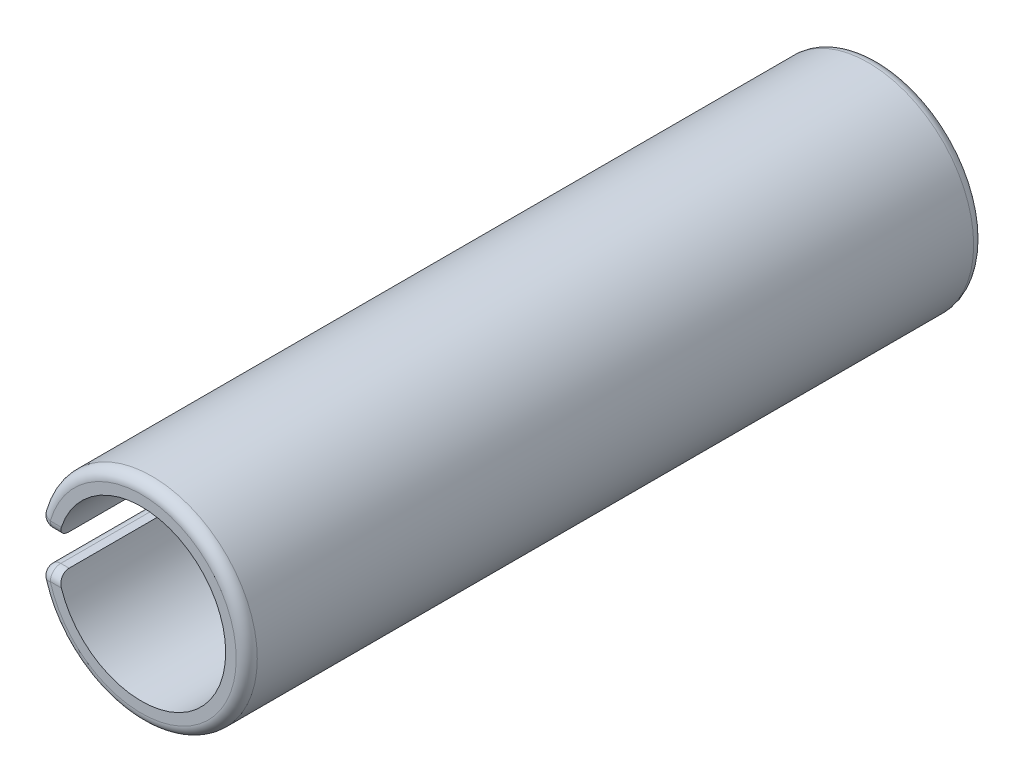
ISO-10303-21;
HEADER;
FILE_DESCRIPTION(('STEP AP214'),'2;1');
FILE_NAME('part.step','',(''),(''),'','','');
FILE_SCHEMA(('AUTOMOTIVE_DESIGN { 1 0 10303 214 1 1 1 1 }'));
ENDSEC;
DATA;
#1=APPLICATION_CONTEXT('core data for automotive mechanical design processes');
#2=APPLICATION_PROTOCOL_DEFINITION('international standard','automotive_design',2000,#1);
#3=PRODUCT_CONTEXT('',#1,'mechanical');
#4=PRODUCT('Part','Part','',(#3));
#5=PRODUCT_RELATED_PRODUCT_CATEGORY('part','',(#4));
#6=PRODUCT_DEFINITION_FORMATION('','',#4);
#7=PRODUCT_DEFINITION_CONTEXT('part definition',#1,'design');
#8=PRODUCT_DEFINITION('design','',#6,#7);
#9=PRODUCT_DEFINITION_SHAPE('','',#8);
#10=(LENGTH_UNIT() NAMED_UNIT(*) SI_UNIT(.MILLI.,.METRE.));
#11=(NAMED_UNIT(*) PLANE_ANGLE_UNIT() SI_UNIT($,.RADIAN.));
#12=(NAMED_UNIT(*) SI_UNIT($,.STERADIAN.) SOLID_ANGLE_UNIT());
#13=UNCERTAINTY_MEASURE_WITH_UNIT(LENGTH_MEASURE(1.E-05),#10,'distance_accuracy_value','');
#14=(GEOMETRIC_REPRESENTATION_CONTEXT(3) GLOBAL_UNCERTAINTY_ASSIGNED_CONTEXT((#13)) GLOBAL_UNIT_ASSIGNED_CONTEXT((#10,
#11,#12)) REPRESENTATION_CONTEXT('',''));
#15=CARTESIAN_POINT('',(0.,0.,0.));
#16=DIRECTION('',(0.,0.,1.));
#17=DIRECTION('',(1.,0.,0.));
#18=AXIS2_PLACEMENT_3D('',#15,#16,#17);
#19=CARTESIAN_POINT('',(0.,0.,7.));
#20=DIRECTION('',(0.,0.,-1.));
#21=DIRECTION('',(-1.,0.,0.));
#22=AXIS2_PLACEMENT_3D('',#19,#20,#21);
#23=CYLINDRICAL_SURFACE('',#22,0.8);
#24=CARTESIAN_POINT('',(0.,0.,0.));
#25=DIRECTION('',(0.,0.,-1.));
#26=DIRECTION('',(1.,0.,0.));
#27=AXIS2_PLACEMENT_3D('',#24,#25,#26);
#28=CIRCLE('',#27,0.8);
#29=CARTESIAN_POINT('',(-0.760178574143633,0.249255963645713,0.));
#30=VERTEX_POINT('',#29);
#31=CARTESIAN_POINT('',(-0.760178574143633,-0.249255963645713,0.));
#32=VERTEX_POINT('',#31);
#33=EDGE_CURVE('E174',#30,#32,#28,.T.);
#34=ORIENTED_EDGE('',*,*,#33,.T.);
#35=CARTESIAN_POINT('',(-0.760178574143633,-0.249255963645713,0.));
#36=CARTESIAN_POINT('',(-0.762034373791151,-0.243604474789476,-4.7820848283987E-06));
#37=CARTESIAN_POINT('',(-0.763823178565598,-0.237927979630275,0.000480037589871912));
#38=CARTESIAN_POINT('',(-0.767233274198211,-0.226685985508127,0.00241954308053262));
#39=CARTESIAN_POINT('',(-0.768854405144669,-0.221120596515532,0.00387514506420562));
#40=CARTESIAN_POINT('',(-0.771894485921598,-0.210264215201868,0.0077500325985201));
#41=CARTESIAN_POINT('',(-0.773313098861837,-0.204973689204183,0.0101708990791594));
#42=CARTESIAN_POINT('',(-0.775924117107872,-0.194856335965049,0.0159227912264894));
#43=CARTESIAN_POINT('',(-0.777116713803933,-0.190029118120206,0.0192530409420635));
#44=CARTESIAN_POINT('',(-0.779233676422341,-0.181149384419126,0.0266154372358896));
#45=CARTESIAN_POINT('',(-0.780165518525607,-0.177076745138274,0.0306211660890916));
#46=CARTESIAN_POINT('',(-0.781813172122858,-0.169654519644624,0.0392954440572709));
#47=CARTESIAN_POINT('',(-0.782528934773591,-0.16630509695854,0.0439641426817826));
#48=CARTESIAN_POINT('',(-0.783734761683959,-0.160525191894378,0.053691497308988));
#49=CARTESIAN_POINT('',(-0.784230415587064,-0.158072270501017,0.058736160579526));
#50=CARTESIAN_POINT('',(-0.785032130913807,-0.154041587974791,0.0691757131598106));
#51=CARTESIAN_POINT('',(-0.785338352374946,-0.152463088225739,0.0745703025734654));
#52=CARTESIAN_POINT('',(-0.785681991062046,-0.150679308070071,0.0833387267293841));
#53=CARTESIAN_POINT('',(-0.785777983935699,-0.150177071738878,0.0866528138086198));
#54=CARTESIAN_POINT('',(-0.785905612550893,-0.149507217659062,0.0933107620777523));
#55=CARTESIAN_POINT('',(-0.785937345921645,-0.149339092304195,0.0966545703366233));
#56=CARTESIAN_POINT('',(-0.785937500001154,-0.149339365519078,0.0999999999998808));
#57=B_SPLINE_CURVE_WITH_KNOTS('',3,(#35,#36,#37,#38,#39,#40,#41,#42,#43,#44,#45,#46,#47,#48,#49,
#50,#51,#52,#53,#54,#55,#56),.UNSPECIFIED.,.F.,.F.,(4,2,2,2,2,2,2,2,2,2,4),(0.,
0.0178294334925496,0.0356757172196497,0.0535513508143839,0.0714117790399948,0.0886900227768253,
0.105972169220704,0.122786073025214,0.139585752533472,0.149629758237893,0.159658492640139),.UNSPECIFIED.);
#58=CARTESIAN_POINT('',(-0.7859375,-0.149339365519444,0.1));
#59=VERTEX_POINT('',#58);
#60=EDGE_CURVE('E125',#32,#59,#57,.T.);
#61=ORIENTED_EDGE('',*,*,#60,.T.);
#62=DIRECTION('',(0.,0.,-1.));
#63=VECTOR('',#62,1.);
#64=CARTESIAN_POINT('',(-0.7859375,-0.149339365519444,7.));
#65=LINE('',#64,#63);
#66=CARTESIAN_POINT('',(-0.7859375,-0.149339365519444,6.9));
#67=VERTEX_POINT('',#66);
#68=EDGE_CURVE('E135',#67,#59,#65,.T.);
#69=ORIENTED_EDGE('',*,*,#68,.F.);
#70=CARTESIAN_POINT('',(-0.7859375,-0.149339365519444,6.9));
#71=CARTESIAN_POINT('',(-0.785936806785317,-0.149334224008504,6.905541611609));
#72=CARTESIAN_POINT('',(-0.785850059611193,-0.149799408980577,6.91108159940369));
#73=CARTESIAN_POINT('',(-0.785499326025954,-0.151632360406898,6.92199870590505));
#74=CARTESIAN_POINT('',(-0.785235525003097,-0.152999182755589,6.92737598882708));
#75=CARTESIAN_POINT('',(-0.784525422446089,-0.156598245657927,6.93782250829476));
#76=CARTESIAN_POINT('',(-0.784079043573676,-0.158830852929112,6.94289161325266));
#77=CARTESIAN_POINT('',(-0.78299556306561,-0.164088917115056,6.95257691781072));
#78=CARTESIAN_POINT('',(-0.782358483913237,-0.167114280559805,6.95719317071633));
#79=CARTESIAN_POINT('',(-0.780883702730964,-0.173875258386546,6.96586339672639));
#80=CARTESIAN_POINT('',(-0.780045272172356,-0.177613441532789,6.96991524158251));
#81=CARTESIAN_POINT('',(-0.77816568728146,-0.185675157011518,6.97733105900853));
#82=CARTESIAN_POINT('',(-0.777124514046398,-0.18999874391284,6.98069496737845));
#83=CARTESIAN_POINT('',(-0.774826156995347,-0.199165898078559,6.98669912228384));
#84=CARTESIAN_POINT('',(-0.773565986501359,-0.204016251629827,6.98932784268251));
#85=CARTESIAN_POINT('',(-0.770853271575422,-0.214037758467675,6.99374036827858));
#86=CARTESIAN_POINT('',(-0.7694007034289,-0.219208951258462,6.99552406919622));
#87=CARTESIAN_POINT('',(-0.766672943352768,-0.228540168507746,6.9979169800578));
#88=CARTESIAN_POINT('',(-0.76543114068079,-0.232666569686373,6.9986999645841));
#89=CARTESIAN_POINT('',(-0.762864086549483,-0.2409511004721,6.99974144747287));
#90=CARTESIAN_POINT('',(-0.761538993327098,-0.245109157468912,7.00000091112432));
#91=CARTESIAN_POINT('',(-0.760178574143787,-0.249255963645637,7.00000000000047));
#92=B_SPLINE_CURVE_WITH_KNOTS('',3,(#70,#71,#72,#73,#74,#75,#76,#77,#78,#79,#80,#81,#82,#83,#84,
#85,#86,#87,#88,#89,#90,#91),.UNSPECIFIED.,.F.,.F.,(4,2,2,2,2,2,2,2,2,2,4),(0.,
0.016602299121161,0.0331872414915355,0.0497792163752727,0.0663692358598374,0.0830202104396774,
0.0996727382221756,0.116573323063502,0.133475992981086,0.146583998529851,0.15966781283933),.UNSPECIFIED.);
#93=CARTESIAN_POINT('',(-0.760178574143633,-0.249255963645713,7.));
#94=VERTEX_POINT('',#93);
#95=EDGE_CURVE('E139',#67,#94,#92,.T.);
#96=ORIENTED_EDGE('',*,*,#95,.T.);
#97=CARTESIAN_POINT('',(0.,0.,7.));
#98=DIRECTION('',(0.,0.,-1.));
#99=DIRECTION('',(1.,0.,0.));
#100=AXIS2_PLACEMENT_3D('',#97,#98,#99);
#101=CIRCLE('',#100,0.8);
#102=CARTESIAN_POINT('',(-0.760178574143633,0.249255963645713,7.));
#103=VERTEX_POINT('',#102);
#104=EDGE_CURVE('E179',#103,#94,#101,.T.);
#105=ORIENTED_EDGE('',*,*,#104,.F.);
#106=CARTESIAN_POINT('',(-0.760178574143633,0.249255963645713,7.));
#107=CARTESIAN_POINT('',(-0.762034373791152,0.243604474789476,7.00000478208483));
#108=CARTESIAN_POINT('',(-0.763823178565598,0.237927979630276,6.99951996241013));
#109=CARTESIAN_POINT('',(-0.767233274198211,0.226685985508128,6.99758045691947));
#110=CARTESIAN_POINT('',(-0.768854405144669,0.221120596515532,6.99612485493579));
#111=CARTESIAN_POINT('',(-0.771894485921598,0.210264215201868,6.99224996740148));
#112=CARTESIAN_POINT('',(-0.773313098861837,0.204973689204183,6.98982910092084));
#113=CARTESIAN_POINT('',(-0.775924117107872,0.194856335965049,6.98407720877351));
#114=CARTESIAN_POINT('',(-0.777116713803933,0.190029118120207,6.98074695905794));
#115=CARTESIAN_POINT('',(-0.779233676422341,0.181149384419126,6.97338456276411));
#116=CARTESIAN_POINT('',(-0.780165518525607,0.177076745138275,6.96937883391091));
#117=CARTESIAN_POINT('',(-0.781813172122858,0.169654519644625,6.96070455594273));
#118=CARTESIAN_POINT('',(-0.782528934773591,0.16630509695854,6.95603585731822));
#119=CARTESIAN_POINT('',(-0.783734761683959,0.160525191894378,6.94630850269101));
#120=CARTESIAN_POINT('',(-0.784230415587063,0.158072270501017,6.94126383942047));
#121=CARTESIAN_POINT('',(-0.785032130913807,0.154041587974791,6.93082428684019));
#122=CARTESIAN_POINT('',(-0.785338352374946,0.152463088225739,6.92542969742654));
#123=CARTESIAN_POINT('',(-0.785681991062046,0.150679308070071,6.91666127327062));
#124=CARTESIAN_POINT('',(-0.785777983935699,0.150177071738878,6.91334718619138));
#125=CARTESIAN_POINT('',(-0.785905612550893,0.149507217659062,6.90668923792225));
#126=CARTESIAN_POINT('',(-0.785937345921645,0.149339092304195,6.90334542966338));
#127=CARTESIAN_POINT('',(-0.785937500001153,0.149339365519078,6.90000000000012));
#128=B_SPLINE_CURVE_WITH_KNOTS('',3,(#106,#107,#108,#109,#110,#111,#112,#113,#114,#115,#116,
#117,#118,#119,#120,#121,#122,#123,#124,#125,#126,#127),.UNSPECIFIED.,.F.,.F.,(4,2,2,2,2,2,2,2,
2,2,4),(0.,0.0178294334925495,0.0356757172196494,0.0535513508143829,0.0714117790399941,
0.0886900227768252,0.105972169220703,0.122786073025214,0.139585752533472,0.149629758237893,
0.159658492640139),.UNSPECIFIED.);
#129=CARTESIAN_POINT('',(-0.7859375,0.149339365519444,6.9));
#130=VERTEX_POINT('',#129);
#131=EDGE_CURVE('E205',#103,#130,#128,.T.);
#132=ORIENTED_EDGE('',*,*,#131,.T.);
#133=DIRECTION('',(0.,0.,-1.));
#134=VECTOR('',#133,1.);
#135=CARTESIAN_POINT('',(-0.7859375,0.149339365519444,7.));
#136=LINE('',#135,#134);
#137=CARTESIAN_POINT('',(-0.7859375,0.149339365519444,0.1));
#138=VERTEX_POINT('',#137);
#139=EDGE_CURVE('E185',#130,#138,#136,.T.);
#140=ORIENTED_EDGE('',*,*,#139,.T.);
#141=CARTESIAN_POINT('',(-0.7859375,0.149339365519444,0.1));
#142=CARTESIAN_POINT('',(-0.785936806785317,0.149334224008504,0.0944583883910013));
#143=CARTESIAN_POINT('',(-0.785850059611193,0.149799408980578,0.088918400596316));
#144=CARTESIAN_POINT('',(-0.785499326025954,0.151632360406898,0.0780012940949516));
#145=CARTESIAN_POINT('',(-0.785235525003097,0.152999182755589,0.0726240111729203));
#146=CARTESIAN_POINT('',(-0.784525422446089,0.156598245657927,0.0621774917052396));
#147=CARTESIAN_POINT('',(-0.784079043573676,0.158830852929112,0.057108386747343));
#148=CARTESIAN_POINT('',(-0.782995563065611,0.164088917115055,0.0474230821892813));
#149=CARTESIAN_POINT('',(-0.782358483913237,0.167114280559804,0.0428068292836715));
#150=CARTESIAN_POINT('',(-0.780883702730965,0.173875258386546,0.0341366032736137));
#151=CARTESIAN_POINT('',(-0.780045272172356,0.177613441532789,0.0300847584174928));
#152=CARTESIAN_POINT('',(-0.77816568728146,0.185675157011518,0.0226689409914739));
#153=CARTESIAN_POINT('',(-0.777124514046398,0.18999874391284,0.0193050326215479));
#154=CARTESIAN_POINT('',(-0.774826156995347,0.199165898078559,0.0133008777161637));
#155=CARTESIAN_POINT('',(-0.773565986501359,0.204016251629827,0.0106721573174859));
#156=CARTESIAN_POINT('',(-0.770853271575422,0.214037758467675,0.00625963172141697));
#157=CARTESIAN_POINT('',(-0.7694007034289,0.219208951258462,0.00447593080378067));
#158=CARTESIAN_POINT('',(-0.766672943352768,0.228540168507746,0.00208301994220113));
#159=CARTESIAN_POINT('',(-0.76543114068079,0.232666569686373,0.00130003541589759));
#160=CARTESIAN_POINT('',(-0.762864086549483,0.2409511004721,0.000258552527129145));
#161=CARTESIAN_POINT('',(-0.761538993327098,0.245109157468912,-9.11124322942692E-07));
#162=CARTESIAN_POINT('',(-0.760178574143787,0.249255963645637,-4.70918247226681E-13));
#163=B_SPLINE_CURVE_WITH_KNOTS('',3,(#141,#142,#143,#144,#145,#146,#147,#148,#149,#150,#151,
#152,#153,#154,#155,#156,#157,#158,#159,#160,#161,#162),.UNSPECIFIED.,.F.,.F.,(4,2,2,2,2,2,2,2,
2,2,4),(0.,0.0166022991211599,0.0331872414915352,0.0497792163752728,0.0663692358598367,
0.0830202104396773,0.0996727382221752,0.116573323063502,0.133475992981086,0.146583998529851,
0.15966781283933),.UNSPECIFIED.);
#164=EDGE_CURVE('E228',#138,#30,#163,.T.);
#165=ORIENTED_EDGE('',*,*,#164,.T.);
#166=EDGE_LOOP('',(#34,#61,#69,#96,#105,#132,#140,#165));
#167=FACE_BOUND('',#166,.T.);
#168=ADVANCED_FACE('F33',(#167),#23,.F.);
#169=CARTESIAN_POINT('',(-0.865023226150975,-0.149597057973271,7.));
#170=DIRECTION('',(0.00325837668062549,-0.999994691476613,0.));
#171=DIRECTION('',(0.999994691476613,0.00325837668062549,0.));
#172=AXIS2_PLACEMENT_3D('',#169,#170,#171);
#173=PLANE('',#172);
#174=ORIENTED_EDGE('',*,*,#68,.T.);
#175=DIRECTION('',(-0.999994691476613,-0.00325837668062549,0.));
#176=VECTOR('',#175,1.);
#177=CARTESIAN_POINT('',(-0.865023226150975,-0.149597057973271,0.1));
#178=LINE('',#177,#176);
#179=CARTESIAN_POINT('',(-0.865023226150975,-0.149597057973271,0.1));
#180=VERTEX_POINT('',#179);
#181=EDGE_CURVE('E134',#59,#180,#178,.T.);
#182=ORIENTED_EDGE('',*,*,#181,.T.);
#183=DIRECTION('',(0.,0.,-1.));
#184=VECTOR('',#183,1.);
#185=CARTESIAN_POINT('',(-0.865023226150975,-0.149597057973271,7.));
#186=LINE('',#185,#184);
#187=CARTESIAN_POINT('',(-0.865023226150975,-0.149597057973271,6.9));
#188=VERTEX_POINT('',#187);
#189=EDGE_CURVE('E119',#188,#180,#186,.T.);
#190=ORIENTED_EDGE('',*,*,#189,.F.);
#191=DIRECTION('',(-0.999994691476613,-0.00325837668062549,0.));
#192=VECTOR('',#191,1.);
#193=CARTESIAN_POINT('',(-0.7859375,-0.149339365519444,6.9));
#194=LINE('',#193,#192);
#195=EDGE_CURVE('E131',#188,#67,#194,.F.);
#196=ORIENTED_EDGE('',*,*,#195,.T.);
#197=EDGE_LOOP('',(#174,#182,#190,#196));
#198=FACE_BOUND('',#197,.T.);
#199=ADVANCED_FACE('F130',(#198),#173,.F.);
#200=CARTESIAN_POINT('',(-0.864697388482912,-0.249596527120932,7.));
#201=DIRECTION('',(0.,0.,-1.));
#202=DIRECTION('',(-1.,0.,0.));
#203=AXIS2_PLACEMENT_3D('',#200,#201,#202);
#204=CYLINDRICAL_SURFACE('',#203,0.1);
#205=ORIENTED_EDGE('',*,*,#189,.T.);
#206=CARTESIAN_POINT('',(-0.864697388482912,-0.249596527120932,0.1));
#207=DIRECTION('',(0.,0.,-1.));
#208=DIRECTION('',(-1.,0.,0.));
#209=AXIS2_PLACEMENT_3D('',#206,#207,#208);
#210=CIRCLE('',#209,0.1);
#211=CARTESIAN_POINT('',(-0.960774876092125,-0.277329474578814,0.1));
#212=VERTEX_POINT('',#211);
#213=EDGE_CURVE('E124',#180,#212,#210,.F.);
#214=ORIENTED_EDGE('',*,*,#213,.T.);
#215=DIRECTION('',(0.,0.,-1.));
#216=VECTOR('',#215,1.);
#217=CARTESIAN_POINT('',(-0.960774876092125,-0.277329474578814,7.));
#218=LINE('',#217,#216);
#219=CARTESIAN_POINT('',(-0.960774876092125,-0.277329474578814,6.9));
#220=VERTEX_POINT('',#219);
#221=EDGE_CURVE('E121',#220,#212,#218,.T.);
#222=ORIENTED_EDGE('',*,*,#221,.F.);
#223=CARTESIAN_POINT('',(-0.864697388482912,-0.249596527120932,6.9));
#224=DIRECTION('',(0.,0.,-1.));
#225=DIRECTION('',(-1.,0.,0.));
#226=AXIS2_PLACEMENT_3D('',#223,#224,#225);
#227=CIRCLE('',#226,0.1);
#228=EDGE_CURVE('E116',#220,#188,#227,.T.);
#229=ORIENTED_EDGE('',*,*,#228,.T.);
#230=EDGE_LOOP('',(#205,#214,#222,#229));
#231=FACE_BOUND('',#230,.T.);
#232=ADVANCED_FACE('F118',(#231),#204,.T.);
#233=CARTESIAN_POINT('',(0.,0.,7.));
#234=DIRECTION('',(0.,0.,-1.));
#235=DIRECTION('',(-1.,0.,0.));
#236=AXIS2_PLACEMENT_3D('',#233,#234,#235);
#237=CYLINDRICAL_SURFACE('',#236,1.);
#238=ORIENTED_EDGE('',*,*,#221,.T.);
#239=CARTESIAN_POINT('',(0.,0.,0.1));
#240=DIRECTION('',(0.,0.,1.));
#241=DIRECTION('',(1.,0.,0.));
#242=AXIS2_PLACEMENT_3D('',#239,#240,#241);
#243=CIRCLE('',#242,1.);
#244=CARTESIAN_POINT('',(-0.960774876092125,0.277329474578813,0.1));
#245=VERTEX_POINT('',#244);
#246=EDGE_CURVE('E11',#212,#245,#243,.T.);
#247=ORIENTED_EDGE('',*,*,#246,.T.);
#248=DIRECTION('',(0.,0.,-1.));
#249=VECTOR('',#248,1.);
#250=CARTESIAN_POINT('',(-0.960774876092125,0.277329474578813,7.));
#251=LINE('',#250,#249);
#252=CARTESIAN_POINT('',(-0.960774876092125,0.277329474578813,6.9));
#253=VERTEX_POINT('',#252);
#254=EDGE_CURVE('E193',#253,#245,#251,.T.);
#255=ORIENTED_EDGE('',*,*,#254,.F.);
#256=CARTESIAN_POINT('',(0.,0.,6.9));
#257=DIRECTION('',(0.,0.,1.));
#258=DIRECTION('',(1.,0.,0.));
#259=AXIS2_PLACEMENT_3D('',#256,#257,#258);
#260=CIRCLE('',#259,1.);
#261=EDGE_CURVE('E43',#253,#220,#260,.F.);
#262=ORIENTED_EDGE('',*,*,#261,.T.);
#263=EDGE_LOOP('',(#238,#247,#255,#262));
#264=FACE_BOUND('',#263,.T.);
#265=ADVANCED_FACE('F274',(#264),#237,.T.);
#266=CARTESIAN_POINT('',(-0.864697388482913,0.249596527120932,7.));
#267=DIRECTION('',(0.,0.,-1.));
#268=DIRECTION('',(-1.,0.,0.));
#269=AXIS2_PLACEMENT_3D('',#266,#267,#268);
#270=CYLINDRICAL_SURFACE('',#269,0.1);
#271=ORIENTED_EDGE('',*,*,#254,.T.);
#272=CARTESIAN_POINT('',(-0.864697388482913,0.249596527120932,0.1));
#273=DIRECTION('',(0.,0.,-1.));
#274=DIRECTION('',(-1.,0.,0.));
#275=AXIS2_PLACEMENT_3D('',#272,#273,#274);
#276=CIRCLE('',#275,0.1);
#277=CARTESIAN_POINT('',(-0.865023226150975,0.149597057973271,0.1));
#278=VERTEX_POINT('',#277);
#279=EDGE_CURVE('E261',#245,#278,#276,.F.);
#280=ORIENTED_EDGE('',*,*,#279,.T.);
#281=DIRECTION('',(0.,0.,-1.));
#282=VECTOR('',#281,1.);
#283=CARTESIAN_POINT('',(-0.865023226150975,0.149597057973271,7.));
#284=LINE('',#283,#282);
#285=CARTESIAN_POINT('',(-0.865023226150975,0.149597057973271,6.9));
#286=VERTEX_POINT('',#285);
#287=EDGE_CURVE('E190',#286,#278,#284,.T.);
#288=ORIENTED_EDGE('',*,*,#287,.F.);
#289=CARTESIAN_POINT('',(-0.864697388482913,0.249596527120932,6.9));
#290=DIRECTION('',(0.,0.,-1.));
#291=DIRECTION('',(-1.,0.,0.));
#292=AXIS2_PLACEMENT_3D('',#289,#290,#291);
#293=CIRCLE('',#292,0.1);
#294=EDGE_CURVE('E257',#286,#253,#293,.T.);
#295=ORIENTED_EDGE('',*,*,#294,.T.);
#296=EDGE_LOOP('',(#271,#280,#288,#295));
#297=FACE_BOUND('',#296,.T.);
#298=ADVANCED_FACE('F290',(#297),#270,.T.);
#299=CARTESIAN_POINT('',(-0.865023226150975,0.149597057973271,7.));
#300=DIRECTION('',(0.00325837668062548,0.999994691476613,0.));
#301=DIRECTION('',(-0.999994691476613,0.00325837668062548,0.));
#302=AXIS2_PLACEMENT_3D('',#299,#300,#301);
#303=PLANE('',#302);
#304=ORIENTED_EDGE('',*,*,#287,.T.);
#305=DIRECTION('',(0.999994691476613,-0.00325837668062548,0.));
#306=VECTOR('',#305,1.);
#307=CARTESIAN_POINT('',(-0.865023226150975,0.149597057973271,0.1));
#308=LINE('',#307,#306);
#309=EDGE_CURVE('E262',#278,#138,#308,.T.);
#310=ORIENTED_EDGE('',*,*,#309,.T.);
#311=ORIENTED_EDGE('',*,*,#139,.F.);
#312=DIRECTION('',(0.999994691476613,-0.00325837668062548,0.));
#313=VECTOR('',#312,1.);
#314=CARTESIAN_POINT('',(-0.865023226150975,0.149597057973271,6.9));
#315=LINE('',#314,#313);
#316=EDGE_CURVE('E265',#130,#286,#315,.F.);
#317=ORIENTED_EDGE('',*,*,#316,.T.);
#318=EDGE_LOOP('',(#304,#310,#311,#317));
#319=FACE_BOUND('',#318,.T.);
#320=ADVANCED_FACE('F291',(#319),#303,.F.);
#321=CARTESIAN_POINT('',(0.,0.,7.));
#322=DIRECTION('',(0.,0.,1.));
#323=DIRECTION('',(1.,0.,0.));
#324=AXIS2_PLACEMENT_3D('',#321,#322,#323);
#325=PLANE('',#324);
#326=ORIENTED_EDGE('',*,*,#104,.T.);
#327=DIRECTION('',(-0.999994691476613,-0.00325837668062549,0.));
#328=VECTOR('',#327,1.);
#329=CARTESIAN_POINT('',(-0.864697388482912,-0.249596527120932,7.));
#330=LINE('',#329,#328);
#331=CARTESIAN_POINT('',(-0.864697388482913,-0.249596527120932,7.));
#332=VERTEX_POINT('',#331);
#333=EDGE_CURVE('E272',#94,#332,#330,.T.);
#334=ORIENTED_EDGE('',*,*,#333,.T.);
#335=CARTESIAN_POINT('',(0.,0.,7.));
#336=DIRECTION('',(0.,0.,1.));
#337=DIRECTION('',(1.,0.,0.));
#338=AXIS2_PLACEMENT_3D('',#335,#336,#337);
#339=CIRCLE('',#338,0.9);
#340=CARTESIAN_POINT('',(-0.864697388482913,0.249596527120932,7.));
#341=VERTEX_POINT('',#340);
#342=EDGE_CURVE('E51',#332,#341,#339,.T.);
#343=ORIENTED_EDGE('',*,*,#342,.T.);
#344=DIRECTION('',(0.999994691476613,-0.00325837668062548,0.));
#345=VECTOR('',#344,1.);
#346=CARTESIAN_POINT('',(-0.785611662331938,0.249338834667105,7.));
#347=LINE('',#346,#345);
#348=EDGE_CURVE('E270',#341,#103,#347,.T.);
#349=ORIENTED_EDGE('',*,*,#348,.T.);
#350=EDGE_LOOP('',(#326,#334,#343,#349));
#351=FACE_BOUND('',#350,.T.);
#352=ADVANCED_FACE('F275',(#351),#325,.T.);
#353=CARTESIAN_POINT('',(0.,0.,0.));
#354=DIRECTION('',(0.,0.,1.));
#355=DIRECTION('',(1.,0.,0.));
#356=AXIS2_PLACEMENT_3D('',#353,#354,#355);
#357=PLANE('',#356);
#358=CARTESIAN_POINT('',(0.,0.,0.));
#359=DIRECTION('',(0.,0.,1.));
#360=DIRECTION('',(1.,0.,0.));
#361=AXIS2_PLACEMENT_3D('',#358,#359,#360);
#362=CIRCLE('',#361,0.9);
#363=CARTESIAN_POINT('',(-0.864697388482913,0.249596527120932,0.));
#364=VERTEX_POINT('',#363);
#365=CARTESIAN_POINT('',(-0.864697388482913,-0.249596527120932,0.));
#366=VERTEX_POINT('',#365);
#367=EDGE_CURVE('E199',#364,#366,#362,.F.);
#368=ORIENTED_EDGE('',*,*,#367,.T.);
#369=DIRECTION('',(-0.999994691476613,-0.00325837668062549,0.));
#370=VECTOR('',#369,1.);
#371=CARTESIAN_POINT('',(0.000804094677971982,-0.246776382300349,0.));
#372=LINE('',#371,#370);
#373=EDGE_CURVE('E203',#366,#32,#372,.F.);
#374=ORIENTED_EDGE('',*,*,#373,.T.);
#375=ORIENTED_EDGE('',*,*,#33,.F.);
#376=DIRECTION('',(0.999994691476613,-0.00325837668062548,0.));
#377=VECTOR('',#376,1.);
#378=CARTESIAN_POINT('',(0.000804094677971978,0.246776382300349,0.));
#379=LINE('',#378,#377);
#380=EDGE_CURVE('E201',#30,#364,#379,.F.);
#381=ORIENTED_EDGE('',*,*,#380,.T.);
#382=EDGE_LOOP('',(#368,#374,#375,#381));
#383=FACE_BOUND('',#382,.T.);
#384=ADVANCED_FACE('F241',(#383),#357,.F.);
#385=CARTESIAN_POINT('',(-0.864697388482913,0.249596527120932,0.1));
#386=DIRECTION('',(0.999994691476613,-0.00325837668062548,0.));
#387=DIRECTION('',(0.00325837668062548,0.999994691476613,0.));
#388=AXIS2_PLACEMENT_3D('',#385,#386,#387);
#389=CYLINDRICAL_SURFACE('',#388,0.1);
#390=ORIENTED_EDGE('',*,*,#164,.F.);
#391=ORIENTED_EDGE('',*,*,#309,.F.);
#392=CARTESIAN_POINT('',(-0.864697388482913,0.249596527120932,0.1));
#393=DIRECTION('',(-0.999994691476613,0.0032583766806254,0.));
#394=DIRECTION('',(-0.0032583766806254,-0.999994691476613,0.));
#395=AXIS2_PLACEMENT_3D('',#392,#393,#394);
#396=CIRCLE('',#395,0.1);
#397=EDGE_CURVE('E147',#364,#278,#396,.T.);
#398=ORIENTED_EDGE('',*,*,#397,.F.);
#399=ORIENTED_EDGE('',*,*,#380,.F.);
#400=EDGE_LOOP('',(#390,#391,#398,#399));
#401=FACE_BOUND('',#400,.T.);
#402=ADVANCED_FACE('F236',(#401),#389,.T.);
#403=CARTESIAN_POINT('',(-0.864697388482913,0.249596527120932,0.1));
#404=DIRECTION('',(0.,0.,1.));
#405=DIRECTION('',(1.,0.,0.));
#406=AXIS2_PLACEMENT_3D('',#403,#404,#405);
#407=SPHERICAL_SURFACE('',#406,0.1);
#408=ORIENTED_EDGE('',*,*,#397,.T.);
#409=ORIENTED_EDGE('',*,*,#279,.F.);
#410=CARTESIAN_POINT('',(-0.864697388482913,0.249596527120932,0.1));
#411=DIRECTION('',(0.277329474578812,0.960774876092126,0.));
#412=DIRECTION('',(-0.960774876092126,0.277329474578812,0.));
#413=AXIS2_PLACEMENT_3D('',#410,#411,#412);
#414=CIRCLE('',#413,0.1);
#415=EDGE_CURVE('E165',#364,#245,#414,.T.);
#416=ORIENTED_EDGE('',*,*,#415,.F.);
#417=EDGE_LOOP('',(#408,#409,#416));
#418=FACE_BOUND('',#417,.T.);
#419=ADVANCED_FACE('F240',(#418),#407,.T.);
#420=CARTESIAN_POINT('',(0.,0.,0.1));
#421=DIRECTION('',(0.,0.,1.));
#422=DIRECTION('',(1.,0.,0.));
#423=AXIS2_PLACEMENT_3D('',#420,#421,#422);
#424=TOROIDAL_SURFACE('',#423,0.9,0.1);
#425=ORIENTED_EDGE('',*,*,#415,.T.);
#426=ORIENTED_EDGE('',*,*,#246,.F.);
#427=CARTESIAN_POINT('',(-0.864697388482913,-0.249596527120932,0.1));
#428=DIRECTION('',(-0.277329474578814,0.960774876092125,0.));
#429=DIRECTION('',(-0.960774876092126,-0.277329474578814,0.));
#430=AXIS2_PLACEMENT_3D('',#427,#428,#429);
#431=CIRCLE('',#430,0.1);
#432=EDGE_CURVE('E158',#366,#212,#431,.T.);
#433=ORIENTED_EDGE('',*,*,#432,.F.);
#434=ORIENTED_EDGE('',*,*,#367,.F.);
#435=EDGE_LOOP('',(#425,#426,#433,#434));
#436=FACE_BOUND('',#435,.T.);
#437=ADVANCED_FACE('F285',(#436),#424,.T.);
#438=CARTESIAN_POINT('',(-0.864697388482912,-0.249596527120932,0.1));
#439=DIRECTION('',(0.,0.,1.));
#440=DIRECTION('',(1.,0.,0.));
#441=AXIS2_PLACEMENT_3D('',#438,#439,#440);
#442=SPHERICAL_SURFACE('',#441,0.1);
#443=ORIENTED_EDGE('',*,*,#432,.T.);
#444=ORIENTED_EDGE('',*,*,#213,.F.);
#445=CARTESIAN_POINT('',(-0.864697388482912,-0.249596527120932,0.1));
#446=DIRECTION('',(0.999994691476613,0.00325837668062539,0.));
#447=DIRECTION('',(-0.00325837668062539,0.999994691476613,0.));
#448=AXIS2_PLACEMENT_3D('',#445,#446,#447);
#449=CIRCLE('',#448,0.1);
#450=EDGE_CURVE('E154',#366,#180,#449,.T.);
#451=ORIENTED_EDGE('',*,*,#450,.F.);
#452=EDGE_LOOP('',(#443,#444,#451));
#453=FACE_BOUND('',#452,.T.);
#454=ADVANCED_FACE('F283',(#453),#442,.T.);
#455=CARTESIAN_POINT('',(-0.864697388482912,-0.249596527120932,0.1));
#456=DIRECTION('',(-0.999994691476613,-0.00325837668062549,0.));
#457=DIRECTION('',(0.00325837668062549,-0.999994691476613,0.));
#458=AXIS2_PLACEMENT_3D('',#455,#456,#457);
#459=CYLINDRICAL_SURFACE('',#458,0.1);
#460=ORIENTED_EDGE('',*,*,#60,.F.);
#461=ORIENTED_EDGE('',*,*,#373,.F.);
#462=ORIENTED_EDGE('',*,*,#450,.T.);
#463=ORIENTED_EDGE('',*,*,#181,.F.);
#464=EDGE_LOOP('',(#460,#461,#462,#463));
#465=FACE_BOUND('',#464,.T.);
#466=ADVANCED_FACE('F221',(#465),#459,.T.);
#467=CARTESIAN_POINT('',(0.000804094677971978,0.246776382300349,6.9));
#468=DIRECTION('',(-0.999994691476613,0.00325837668062548,0.));
#469=DIRECTION('',(-0.00325837668062548,-0.999994691476613,0.));
#470=AXIS2_PLACEMENT_3D('',#467,#468,#469);
#471=CYLINDRICAL_SURFACE('',#470,0.1);
#472=CARTESIAN_POINT('',(-0.864697388482913,0.249596527120932,6.9));
#473=DIRECTION('',(-0.999994691476613,0.0032583766806254,0.));
#474=DIRECTION('',(-0.0032583766806254,-0.999994691476613,0.));
#475=AXIS2_PLACEMENT_3D('',#472,#473,#474);
#476=CIRCLE('',#475,0.1);
#477=EDGE_CURVE('E38',#286,#341,#476,.T.);
#478=ORIENTED_EDGE('',*,*,#477,.F.);
#479=ORIENTED_EDGE('',*,*,#316,.F.);
#480=ORIENTED_EDGE('',*,*,#131,.F.);
#481=ORIENTED_EDGE('',*,*,#348,.F.);
#482=EDGE_LOOP('',(#478,#479,#480,#481));
#483=FACE_BOUND('',#482,.T.);
#484=ADVANCED_FACE('F35',(#483),#471,.T.);
#485=CARTESIAN_POINT('',(-0.864697388482913,0.249596527120932,6.9));
#486=DIRECTION('',(0.,0.,1.));
#487=DIRECTION('',(1.,0.,0.));
#488=AXIS2_PLACEMENT_3D('',#485,#486,#487);
#489=SPHERICAL_SURFACE('',#488,0.1);
#490=ORIENTED_EDGE('',*,*,#294,.F.);
#491=ORIENTED_EDGE('',*,*,#477,.T.);
#492=CARTESIAN_POINT('',(-0.864697388482913,0.249596527120932,6.9));
#493=DIRECTION('',(0.277329474578812,0.960774876092126,0.));
#494=DIRECTION('',(-0.960774876092126,0.277329474578812,0.));
#495=AXIS2_PLACEMENT_3D('',#492,#493,#494);
#496=CIRCLE('',#495,0.1);
#497=EDGE_CURVE('E144',#253,#341,#496,.T.);
#498=ORIENTED_EDGE('',*,*,#497,.F.);
#499=EDGE_LOOP('',(#490,#491,#498));
#500=FACE_BOUND('',#499,.T.);
#501=ADVANCED_FACE('F251',(#500),#489,.T.);
#502=CARTESIAN_POINT('',(0.,0.,6.9));
#503=DIRECTION('',(0.,0.,1.));
#504=DIRECTION('',(1.,0.,0.));
#505=AXIS2_PLACEMENT_3D('',#502,#503,#504);
#506=TOROIDAL_SURFACE('',#505,0.9,0.1);
#507=CARTESIAN_POINT('',(-0.864697388482913,-0.249596527120932,6.9));
#508=DIRECTION('',(-0.277329474578814,0.960774876092125,0.));
#509=DIRECTION('',(-0.960774876092125,-0.277329474578814,0.));
#510=AXIS2_PLACEMENT_3D('',#507,#508,#509);
#511=CIRCLE('',#510,0.1);
#512=EDGE_CURVE('E142',#220,#332,#511,.T.);
#513=ORIENTED_EDGE('',*,*,#512,.F.);
#514=ORIENTED_EDGE('',*,*,#261,.F.);
#515=ORIENTED_EDGE('',*,*,#497,.T.);
#516=ORIENTED_EDGE('',*,*,#342,.F.);
#517=EDGE_LOOP('',(#513,#514,#515,#516));
#518=FACE_BOUND('',#517,.T.);
#519=ADVANCED_FACE('F249',(#518),#506,.T.);
#520=CARTESIAN_POINT('',(-0.864697388482912,-0.249596527120932,6.9));
#521=DIRECTION('',(0.,0.,1.));
#522=DIRECTION('',(1.,0.,0.));
#523=AXIS2_PLACEMENT_3D('',#520,#521,#522);
#524=SPHERICAL_SURFACE('',#523,0.1);
#525=ORIENTED_EDGE('',*,*,#228,.F.);
#526=ORIENTED_EDGE('',*,*,#512,.T.);
#527=CARTESIAN_POINT('',(-0.864697388482912,-0.249596527120932,6.9));
#528=DIRECTION('',(0.999994691476613,0.0032583766806254,0.));
#529=DIRECTION('',(-0.0032583766806254,0.999994691476613,0.));
#530=AXIS2_PLACEMENT_3D('',#527,#528,#529);
#531=CIRCLE('',#530,0.1);
#532=EDGE_CURVE('E59',#188,#332,#531,.T.);
#533=ORIENTED_EDGE('',*,*,#532,.F.);
#534=EDGE_LOOP('',(#525,#526,#533));
#535=FACE_BOUND('',#534,.T.);
#536=ADVANCED_FACE('F141',(#535),#524,.T.);
#537=CARTESIAN_POINT('',(0.000804094677971982,-0.246776382300349,6.9));
#538=DIRECTION('',(0.999994691476613,0.00325837668062549,0.));
#539=DIRECTION('',(-0.00325837668062549,0.999994691476613,0.));
#540=AXIS2_PLACEMENT_3D('',#537,#538,#539);
#541=CYLINDRICAL_SURFACE('',#540,0.1);
#542=ORIENTED_EDGE('',*,*,#95,.F.);
#543=ORIENTED_EDGE('',*,*,#195,.F.);
#544=ORIENTED_EDGE('',*,*,#532,.T.);
#545=ORIENTED_EDGE('',*,*,#333,.F.);
#546=EDGE_LOOP('',(#542,#543,#544,#545));
#547=FACE_BOUND('',#546,.T.);
#548=ADVANCED_FACE('F138',(#547),#541,.T.);
#549=CLOSED_SHELL('',(#168,#199,#232,#265,#298,#320,#352,#384,#402,#419,#437,#454,#466,#484,
#501,#519,#536,#548));
#550=MANIFOLD_SOLID_BREP('B2',#549);
#551=ADVANCED_BREP_SHAPE_REPRESENTATION('',(#18,#550),#14);
#552=SHAPE_DEFINITION_REPRESENTATION(#9,#551);
ENDSEC;
END-ISO-10303-21;
